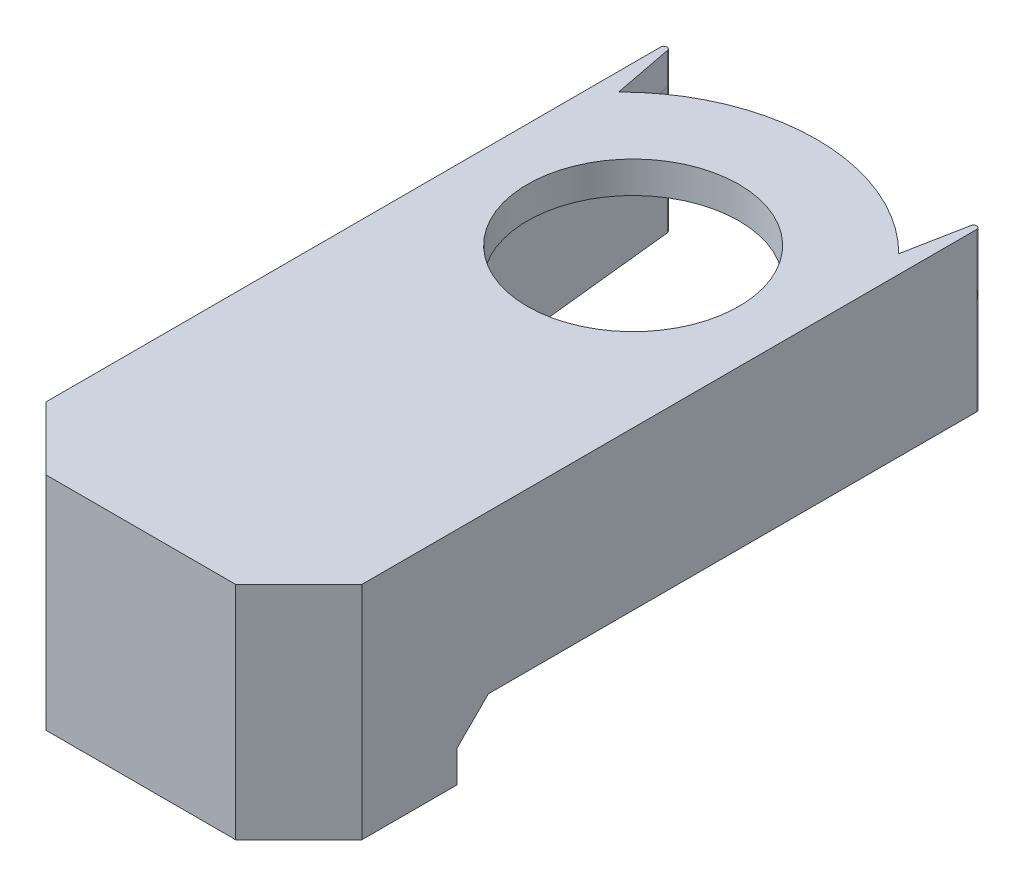
ISO-10303-21;
HEADER;
FILE_DESCRIPTION(('STEP AP214'),'2;1');
FILE_NAME('part.step','',(''),(''),'','','');
FILE_SCHEMA(('AUTOMOTIVE_DESIGN { 1 0 10303 214 1 1 1 1 }'));
ENDSEC;
DATA;
#1=APPLICATION_CONTEXT('core data for automotive mechanical design processes');
#2=APPLICATION_PROTOCOL_DEFINITION('international standard','automotive_design',2000,#1);
#3=PRODUCT_CONTEXT('',#1,'mechanical');
#4=PRODUCT('Part','Part','',(#3));
#5=PRODUCT_RELATED_PRODUCT_CATEGORY('part','',(#4));
#6=PRODUCT_DEFINITION_FORMATION('','',#4);
#7=PRODUCT_DEFINITION_CONTEXT('part definition',#1,'design');
#8=PRODUCT_DEFINITION('design','',#6,#7);
#9=PRODUCT_DEFINITION_SHAPE('','',#8);
#10=(LENGTH_UNIT() NAMED_UNIT(*) SI_UNIT(.MILLI.,.METRE.));
#11=(NAMED_UNIT(*) PLANE_ANGLE_UNIT() SI_UNIT($,.RADIAN.));
#12=(NAMED_UNIT(*) SI_UNIT($,.STERADIAN.) SOLID_ANGLE_UNIT());
#13=UNCERTAINTY_MEASURE_WITH_UNIT(LENGTH_MEASURE(1.E-05),#10,'distance_accuracy_value','');
#14=(GEOMETRIC_REPRESENTATION_CONTEXT(3) GLOBAL_UNCERTAINTY_ASSIGNED_CONTEXT((#13)) GLOBAL_UNIT_ASSIGNED_CONTEXT((#10,
#11,#12)) REPRESENTATION_CONTEXT('',''));
#15=CARTESIAN_POINT('',(0.,0.,0.));
#16=DIRECTION('',(0.,0.,1.));
#17=DIRECTION('',(1.,0.,0.));
#18=AXIS2_PLACEMENT_3D('',#15,#16,#17);
#19=CARTESIAN_POINT('',(-0.455233557203393,-11.7908287077193,19.5532997905264));
#20=DIRECTION('',(0.,1.,0.));
#21=DIRECTION('',(0.,0.,1.));
#22=AXIS2_PLACEMENT_3D('',#19,#20,#21);
#23=CYLINDRICAL_SURFACE('',#22,8.255);
#24=DIRECTION('',(0.,1.,0.));
#25=VECTOR('',#24,1.);
#26=CARTESIAN_POINT('',(-5.94705227001541,22.4991712922807,25.7164931369668));
#27=LINE('',#26,#25);
#28=CARTESIAN_POINT('',(-5.9470522700154,27.5791712922807,25.7164931369668));
#29=VERTEX_POINT('',#28);
#30=CARTESIAN_POINT('',(-5.94705227001542,17.4191712922807,25.7164931369668));
#31=VERTEX_POINT('',#30);
#32=EDGE_CURVE('E11',#29,#31,#27,.F.);
#33=ORIENTED_EDGE('',*,*,#32,.F.);
#34=CARTESIAN_POINT('',(-0.45523355720339,27.5791712922807,19.5532997905264));
#35=DIRECTION('',(0.,-1.,0.));
#36=DIRECTION('',(0.,0.,1.));
#37=AXIS2_PLACEMENT_3D('',#34,#35,#36);
#38=CIRCLE('',#37,8.255);
#39=CARTESIAN_POINT('',(6.06643984892261,27.5791712922807,24.6142088969843));
#40=VERTEX_POINT('',#39);
#41=EDGE_CURVE('E25',#40,#29,#38,.T.);
#42=ORIENTED_EDGE('',*,*,#41,.F.);
#43=DIRECTION('',(0.,1.,0.));
#44=VECTOR('',#43,1.);
#45=CARTESIAN_POINT('',(6.06643984892261,22.4991712922807,24.6142088969843));
#46=LINE('',#45,#44);
#47=CARTESIAN_POINT('',(6.06643984892261,17.4191712922807,24.6142088969843));
#48=VERTEX_POINT('',#47);
#49=EDGE_CURVE('E370',#48,#40,#46,.T.);
#50=ORIENTED_EDGE('',*,*,#49,.F.);
#51=CARTESIAN_POINT('',(-0.455233557203393,17.4191712922807,19.5532997905264));
#52=DIRECTION('',(0.,1.,0.));
#53=DIRECTION('',(0.,0.,1.));
#54=AXIS2_PLACEMENT_3D('',#51,#52,#53);
#55=CIRCLE('',#54,8.255);
#56=EDGE_CURVE('E367',#48,#31,#55,.F.);
#57=ORIENTED_EDGE('',*,*,#56,.T.);
#58=EDGE_LOOP('',(#33,#42,#50,#57));
#59=FACE_BOUND('',#58,.T.);
#60=ADVANCED_FACE('F17',(#59),#23,.F.);
#61=CARTESIAN_POINT('',(-13.1552335572034,17.4191712922807,-6.56059905085164));
#62=DIRECTION('',(0.,1.,0.));
#63=DIRECTION('',(0.,0.,1.));
#64=AXIS2_PLACEMENT_3D('',#61,#62,#63);
#65=PLANE('',#64);
#66=CARTESIAN_POINT('',(-0.687313488091051,17.4191712922807,17.0239245898732));
#67=DIRECTION('',(0.,1.,0.));
#68=DIRECTION('',(0.,0.,1.));
#69=AXIS2_PLACEMENT_3D('',#66,#67,#68);
#70=CIRCLE('',#69,10.16);
#71=CARTESIAN_POINT('',(9.47268651190895,17.4191712922807,17.0239245898732));
#72=VERTEX_POINT('',#71);
#73=EDGE_CURVE('E364',#48,#72,#70,.T.);
#74=ORIENTED_EDGE('',*,*,#73,.T.);
#75=DIRECTION('',(0.131328349639009,0.,-0.991338925182046));
#76=VECTOR('',#75,1.);
#77=CARTESIAN_POINT('',(11.7413599631441,17.4191712922807,-0.101275771804154));
#78=LINE('',#77,#76);
#79=CARTESIAN_POINT('',(11.7413599631441,17.4191712922807,-0.101275771804154));
#80=VERTEX_POINT('',#79);
#81=EDGE_CURVE('E361',#72,#80,#78,.T.);
#82=ORIENTED_EDGE('',*,*,#81,.T.);
#83=CARTESIAN_POINT('',(11.9907664427966,17.4191712922807,-0.0531882691935941));
#84=DIRECTION('',(0.,1.,0.));
#85=DIRECTION('',(0.,0.,1.));
#86=AXIS2_PLACEMENT_3D('',#83,#84,#85);
#87=CIRCLE('',#86,0.254);
#88=CARTESIAN_POINT('',(12.2447664427966,17.4191712922807,-0.0531882691935941));
#89=VERTEX_POINT('',#88);
#90=EDGE_CURVE('E358',#80,#89,#87,.F.);
#91=ORIENTED_EDGE('',*,*,#90,.T.);
#92=DIRECTION('',(0.,0.,1.));
#93=VECTOR('',#92,1.);
#94=CARTESIAN_POINT('',(12.2447664427966,17.4191712922807,-6.56059905085164));
#95=LINE('',#94,#93);
#96=CARTESIAN_POINT('',(12.2447664427966,17.4191712922807,39.1977997445264));
#97=VERTEX_POINT('',#96);
#98=EDGE_CURVE('E355',#89,#97,#95,.T.);
#99=ORIENTED_EDGE('',*,*,#98,.T.);
#100=DIRECTION('',(-1.,0.,0.));
#101=VECTOR('',#100,1.);
#102=CARTESIAN_POINT('',(-13.1552335572034,17.4191712922807,39.1977997445264));
#103=LINE('',#102,#101);
#104=CARTESIAN_POINT('',(-13.1552335572034,17.4191712922807,39.1977997445264));
#105=VERTEX_POINT('',#104);
#106=EDGE_CURVE('E352',#97,#105,#103,.T.);
#107=ORIENTED_EDGE('',*,*,#106,.T.);
#108=DIRECTION('',(0.,0.,1.));
#109=VECTOR('',#108,1.);
#110=CARTESIAN_POINT('',(-13.1552335572034,17.4191712922807,-6.56059905085164));
#111=LINE('',#110,#109);
#112=CARTESIAN_POINT('',(-13.1552335572034,17.4191712922807,-0.053188269193601));
#113=VERTEX_POINT('',#112);
#114=EDGE_CURVE('E348',#113,#105,#111,.T.);
#115=ORIENTED_EDGE('',*,*,#114,.F.);
#116=CARTESIAN_POINT('',(-12.9012335572034,17.4191712922807,-0.053188269193601));
#117=DIRECTION('',(0.,1.,0.));
#118=DIRECTION('',(0.,0.,1.));
#119=AXIS2_PLACEMENT_3D('',#116,#117,#118);
#120=CIRCLE('',#119,0.254);
#121=CARTESIAN_POINT('',(-12.6518270775508,17.4191712922807,-0.101275771804161));
#122=VERTEX_POINT('',#121);
#123=EDGE_CURVE('E345',#113,#122,#120,.F.);
#124=ORIENTED_EDGE('',*,*,#123,.T.);
#125=DIRECTION('',(0.104791666901886,0.,0.994494196336974));
#126=VECTOR('',#125,1.);
#127=CARTESIAN_POINT('',(-12.6518270775508,17.4191712922807,-0.101275771804161));
#128=LINE('',#127,#126);
#129=CARTESIAN_POINT('',(-10.8473134880911,17.4191712922807,17.0239245898732));
#130=VERTEX_POINT('',#129);
#131=EDGE_CURVE('E342',#122,#130,#128,.T.);
#132=ORIENTED_EDGE('',*,*,#131,.T.);
#133=EDGE_CURVE('E194',#130,#31,#70,.T.);
#134=ORIENTED_EDGE('',*,*,#133,.T.);
#135=ORIENTED_EDGE('',*,*,#56,.F.);
#136=EDGE_LOOP('',(#74,#82,#91,#99,#107,#115,#124,#132,#134,#135));
#137=FACE_BOUND('',#136,.T.);
#138=ADVANCED_FACE('F468',(#137),#65,.F.);
#139=CARTESIAN_POINT('',(-13.1552335572034,-11.7908287077193,-2.71220025547363));
#140=DIRECTION('',(-0.981915274222651,0.,0.189320876419524));
#141=DIRECTION('',(0.189320876419524,0.,0.981915274222651));
#142=AXIS2_PLACEMENT_3D('',#139,#140,#141);
#143=PLANE('',#142);
#144=DIRECTION('',(-0.189320876419524,0.,-0.981915274222651));
#145=VECTOR('',#144,1.);
#146=CARTESIAN_POINT('',(-13.1552335572034,30.1191712922807,-2.71220025547363));
#147=LINE('',#146,#145);
#148=CARTESIAN_POINT('',(-11.7130471803084,30.1191712922807,4.76771880327323));
#149=VERTEX_POINT('',#148);
#150=CARTESIAN_POINT('',(-12.6518270775508,30.1191712922807,-0.101275771804161));
#151=VERTEX_POINT('',#150);
#152=EDGE_CURVE('E338',#149,#151,#147,.T.);
#153=ORIENTED_EDGE('',*,*,#152,.F.);
#154=DIRECTION('',(0.,1.,0.));
#155=VECTOR('',#154,1.);
#156=CARTESIAN_POINT('',(-11.7130471803084,2.28078660067512,4.76771880327323));
#157=LINE('',#156,#155);
#158=CARTESIAN_POINT('',(-11.7130471803084,27.5791712922807,4.76771880327323));
#159=VERTEX_POINT('',#158);
#160=EDGE_CURVE('E334',#159,#149,#157,.T.);
#161=ORIENTED_EDGE('',*,*,#160,.F.);
#162=DIRECTION('',(-0.189320876419524,0.,-0.981915274222651));
#163=VECTOR('',#162,1.);
#164=CARTESIAN_POINT('',(-13.1552335572034,27.5791712922807,-2.71220025547363));
#165=LINE('',#164,#163);
#166=CARTESIAN_POINT('',(-12.6518270775508,27.5791712922807,-0.101275771804161));
#167=VERTEX_POINT('',#166);
#168=EDGE_CURVE('E331',#159,#167,#165,.T.);
#169=ORIENTED_EDGE('',*,*,#168,.T.);
#170=DIRECTION('',(0.,-1.,0.));
#171=VECTOR('',#170,1.);
#172=CARTESIAN_POINT('',(-12.6518270775508,-11.7908287077193,-0.101275771804161));
#173=LINE('',#172,#171);
#174=EDGE_CURVE('E328',#167,#151,#173,.F.);
#175=ORIENTED_EDGE('',*,*,#174,.T.);
#176=EDGE_LOOP('',(#153,#161,#169,#175));
#177=FACE_BOUND('',#176,.T.);
#178=ADVANCED_FACE('F457',(#177),#143,.F.);
#179=CARTESIAN_POINT('',(12.2447664427966,-11.7908287077193,-2.71220025547363));
#180=DIRECTION('',(0.981915274222651,0.,0.189320876419524));
#181=DIRECTION('',(0.189320876419524,0.,-0.981915274222651));
#182=AXIS2_PLACEMENT_3D('',#179,#180,#181);
#183=PLANE('',#182);
#184=DIRECTION('',(-0.189320876419524,0.,0.981915274222651));
#185=VECTOR('',#184,1.);
#186=CARTESIAN_POINT('',(12.2447664427966,27.5791712922807,-2.71220025547363));
#187=LINE('',#186,#185);
#188=CARTESIAN_POINT('',(11.7413599631441,27.5791712922807,-0.101275771804154));
#189=VERTEX_POINT('',#188);
#190=CARTESIAN_POINT('',(10.8025800659016,27.5791712922807,4.76771880327323));
#191=VERTEX_POINT('',#190);
#192=EDGE_CURVE('E325',#189,#191,#187,.T.);
#193=ORIENTED_EDGE('',*,*,#192,.T.);
#194=DIRECTION('',(0.,1.,0.));
#195=VECTOR('',#194,1.);
#196=CARTESIAN_POINT('',(10.8025800659016,2.28078660067512,4.76771880327322));
#197=LINE('',#196,#195);
#198=CARTESIAN_POINT('',(10.8025800659016,30.1191712922807,4.76771880327323));
#199=VERTEX_POINT('',#198);
#200=EDGE_CURVE('E322',#191,#199,#197,.T.);
#201=ORIENTED_EDGE('',*,*,#200,.T.);
#202=DIRECTION('',(-0.189320876419524,0.,0.981915274222651));
#203=VECTOR('',#202,1.);
#204=CARTESIAN_POINT('',(12.2447664427966,30.1191712922807,-2.71220025547363));
#205=LINE('',#204,#203);
#206=CARTESIAN_POINT('',(11.7413599631441,30.1191712922807,-0.101275771804154));
#207=VERTEX_POINT('',#206);
#208=EDGE_CURVE('E318',#207,#199,#205,.T.);
#209=ORIENTED_EDGE('',*,*,#208,.F.);
#210=DIRECTION('',(0.,-1.,0.));
#211=VECTOR('',#210,1.);
#212=CARTESIAN_POINT('',(11.7413599631441,-11.7908287077193,-0.101275771804154));
#213=LINE('',#212,#211);
#214=EDGE_CURVE('E315',#207,#189,#213,.T.);
#215=ORIENTED_EDGE('',*,*,#214,.T.);
#216=EDGE_LOOP('',(#193,#201,#209,#215));
#217=FACE_BOUND('',#216,.T.);
#218=ADVANCED_FACE('F460',(#217),#183,.F.);
#219=CARTESIAN_POINT('',(-13.1552335572034,32.6591712922807,41.7377997445264));
#220=DIRECTION('',(1.,0.,0.));
#221=DIRECTION('',(0.,0.,-1.));
#222=AXIS2_PLACEMENT_3D('',#219,#220,#221);
#223=PLANE('',#222);
#224=DIRECTION('',(0.,0.,1.));
#225=VECTOR('',#224,1.);
#226=CARTESIAN_POINT('',(-13.1552335572034,30.1191712922807,41.7377997445264));
#227=LINE('',#226,#225);
#228=CARTESIAN_POINT('',(-13.1552335572034,30.1191712922807,-0.0531882691935975));
#229=VERTEX_POINT('',#228);
#230=CARTESIAN_POINT('',(-13.1552335572034,30.1191712922807,49.3577997445264));
#231=VERTEX_POINT('',#230);
#232=EDGE_CURVE('E311',#229,#231,#227,.T.);
#233=ORIENTED_EDGE('',*,*,#232,.F.);
#234=DIRECTION('',(0.,-1.,0.));
#235=VECTOR('',#234,1.);
#236=CARTESIAN_POINT('',(-13.1552335572034,32.6591712922807,-0.053188269193601));
#237=LINE('',#236,#235);
#238=EDGE_CURVE('E307',#229,#113,#237,.T.);
#239=ORIENTED_EDGE('',*,*,#238,.T.);
#240=ORIENTED_EDGE('',*,*,#114,.T.);
#241=DIRECTION('',(0.,0.707106781186552,-0.707106781186543));
#242=VECTOR('',#241,1.);
#243=CARTESIAN_POINT('',(-13.1552335572034,23.7691712922808,32.8477997445264));
#244=LINE('',#243,#242);
#245=CARTESIAN_POINT('',(-13.1552335572034,14.8791712922807,41.7377997445264));
#246=VERTEX_POINT('',#245);
#247=EDGE_CURVE('E304',#105,#246,#244,.F.);
#248=ORIENTED_EDGE('',*,*,#247,.T.);
#249=DIRECTION('',(0.,-1.,0.));
#250=VECTOR('',#249,1.);
#251=CARTESIAN_POINT('',(-13.1552335572034,-11.7908287077193,41.7377997445264));
#252=LINE('',#251,#250);
#253=CARTESIAN_POINT('',(-13.1552335572034,12.3391712922807,41.7377997445264));
#254=VERTEX_POINT('',#253);
#255=EDGE_CURVE('E301',#246,#254,#252,.T.);
#256=ORIENTED_EDGE('',*,*,#255,.T.);
#257=DIRECTION('',(0.,0.,-1.));
#258=VECTOR('',#257,1.);
#259=CARTESIAN_POINT('',(-13.1552335572034,12.3391712922807,41.7377997445264));
#260=LINE('',#259,#258);
#261=CARTESIAN_POINT('',(-13.1552335572034,12.3391712922807,49.3577997445264));
#262=VERTEX_POINT('',#261);
#263=EDGE_CURVE('E297',#262,#254,#260,.T.);
#264=ORIENTED_EDGE('',*,*,#263,.F.);
#265=DIRECTION('',(0.,1.,0.));
#266=VECTOR('',#265,1.);
#267=CARTESIAN_POINT('',(-13.1552335572034,32.6591712922807,49.3577997445264));
#268=LINE('',#267,#266);
#269=EDGE_CURVE('E294',#262,#231,#268,.T.);
#270=ORIENTED_EDGE('',*,*,#269,.T.);
#271=EDGE_LOOP('',(#233,#239,#240,#248,#256,#264,#270));
#272=FACE_BOUND('',#271,.T.);
#273=ADVANCED_FACE('F479',(#272),#223,.F.);
#274=CARTESIAN_POINT('',(12.2447664427966,32.6591712922807,41.7377997445264));
#275=DIRECTION('',(-1.,0.,0.));
#276=DIRECTION('',(0.,0.,1.));
#277=AXIS2_PLACEMENT_3D('',#274,#275,#276);
#278=PLANE('',#277);
#279=DIRECTION('',(0.,0.,-1.));
#280=VECTOR('',#279,1.);
#281=CARTESIAN_POINT('',(12.2447664427966,30.1191712922807,41.7377997445264));
#282=LINE('',#281,#280);
#283=CARTESIAN_POINT('',(12.2447664427966,30.1191712922807,49.3577997445264));
#284=VERTEX_POINT('',#283);
#285=CARTESIAN_POINT('',(12.2447664427966,30.1191712922807,-0.0531882691935941));
#286=VERTEX_POINT('',#285);
#287=EDGE_CURVE('E290',#284,#286,#282,.T.);
#288=ORIENTED_EDGE('',*,*,#287,.F.);
#289=DIRECTION('',(0.,-1.,0.));
#290=VECTOR('',#289,1.);
#291=CARTESIAN_POINT('',(12.2447664427966,-11.7908287077193,49.3577997445264));
#292=LINE('',#291,#290);
#293=CARTESIAN_POINT('',(12.2447664427966,12.3391712922807,49.3577997445264));
#294=VERTEX_POINT('',#293);
#295=EDGE_CURVE('E287',#284,#294,#292,.T.);
#296=ORIENTED_EDGE('',*,*,#295,.T.);
#297=DIRECTION('',(0.,0.,1.));
#298=VECTOR('',#297,1.);
#299=CARTESIAN_POINT('',(12.2447664427966,12.3391712922807,41.7377997445264));
#300=LINE('',#299,#298);
#301=CARTESIAN_POINT('',(12.2447664427966,12.3391712922807,41.7377997445264));
#302=VERTEX_POINT('',#301);
#303=EDGE_CURVE('E283',#302,#294,#300,.T.);
#304=ORIENTED_EDGE('',*,*,#303,.F.);
#305=DIRECTION('',(0.,1.,0.));
#306=VECTOR('',#305,1.);
#307=CARTESIAN_POINT('',(12.2447664427966,-11.7908287077193,41.7377997445264));
#308=LINE('',#307,#306);
#309=CARTESIAN_POINT('',(12.2447664427966,14.8791712922807,41.7377997445264));
#310=VERTEX_POINT('',#309);
#311=EDGE_CURVE('E280',#302,#310,#308,.T.);
#312=ORIENTED_EDGE('',*,*,#311,.T.);
#313=DIRECTION('',(0.,-0.707106781186552,0.707106781186543));
#314=VECTOR('',#313,1.);
#315=CARTESIAN_POINT('',(12.2447664427966,23.7691712922808,32.8477997445264));
#316=LINE('',#315,#314);
#317=EDGE_CURVE('E276',#310,#97,#316,.F.);
#318=ORIENTED_EDGE('',*,*,#317,.T.);
#319=ORIENTED_EDGE('',*,*,#98,.F.);
#320=DIRECTION('',(0.,-1.,0.));
#321=VECTOR('',#320,1.);
#322=CARTESIAN_POINT('',(12.2447664427966,32.6591712922807,-0.0531882691935941));
#323=LINE('',#322,#321);
#324=EDGE_CURVE('E273',#89,#286,#323,.F.);
#325=ORIENTED_EDGE('',*,*,#324,.T.);
#326=EDGE_LOOP('',(#288,#296,#304,#312,#318,#319,#325));
#327=FACE_BOUND('',#326,.T.);
#328=ADVANCED_FACE('F470',(#327),#278,.F.);
#329=CARTESIAN_POINT('',(-13.1552335572034,-11.7908287077193,54.4377997445264));
#330=DIRECTION('',(0.,0.,1.));
#331=DIRECTION('',(1.,0.,0.));
#332=AXIS2_PLACEMENT_3D('',#329,#330,#331);
#333=PLANE('',#332);
#334=DIRECTION('',(0.,1.,0.));
#335=VECTOR('',#334,1.);
#336=CARTESIAN_POINT('',(7.16476644279661,32.6591712922807,54.4377997445264));
#337=LINE('',#336,#335);
#338=CARTESIAN_POINT('',(7.16476644279661,12.3391712922807,54.4377997445264));
#339=VERTEX_POINT('',#338);
#340=CARTESIAN_POINT('',(7.16476644279661,30.1191712922807,54.4377997445264));
#341=VERTEX_POINT('',#340);
#342=EDGE_CURVE('E270',#339,#341,#337,.T.);
#343=ORIENTED_EDGE('',*,*,#342,.T.);
#344=DIRECTION('',(-1.,0.,0.));
#345=VECTOR('',#344,1.);
#346=CARTESIAN_POINT('',(-13.1552335572034,30.1191712922807,54.4377997445264));
#347=LINE('',#346,#345);
#348=CARTESIAN_POINT('',(-8.0752335572034,30.1191712922807,54.4377997445264));
#349=VERTEX_POINT('',#348);
#350=EDGE_CURVE('E267',#341,#349,#347,.T.);
#351=ORIENTED_EDGE('',*,*,#350,.T.);
#352=DIRECTION('',(0.,-1.,0.));
#353=VECTOR('',#352,1.);
#354=CARTESIAN_POINT('',(-8.0752335572034,-11.7908287077193,54.4377997445264));
#355=LINE('',#354,#353);
#356=CARTESIAN_POINT('',(-8.0752335572034,12.3391712922807,54.4377997445264));
#357=VERTEX_POINT('',#356);
#358=EDGE_CURVE('E264',#349,#357,#355,.T.);
#359=ORIENTED_EDGE('',*,*,#358,.T.);
#360=DIRECTION('',(1.,0.,0.));
#361=VECTOR('',#360,1.);
#362=CARTESIAN_POINT('',(-13.1552335572034,12.3391712922807,54.4377997445264));
#363=LINE('',#362,#361);
#364=EDGE_CURVE('E261',#357,#339,#363,.T.);
#365=ORIENTED_EDGE('',*,*,#364,.T.);
#366=EDGE_LOOP('',(#343,#351,#359,#365));
#367=FACE_BOUND('',#366,.T.);
#368=ADVANCED_FACE('F502',(#367),#333,.T.);
#369=CARTESIAN_POINT('',(7.16476644279661,-11.7908287077193,54.4377997445264));
#370=DIRECTION('',(0.707106781186549,0.,0.707106781186546));
#371=DIRECTION('',(0.,-1.,0.));
#372=AXIS2_PLACEMENT_3D('',#369,#370,#371);
#373=PLANE('',#372);
#374=ORIENTED_EDGE('',*,*,#295,.F.);
#375=DIRECTION('',(-0.707106781186546,0.,0.707106781186549));
#376=VECTOR('',#375,1.);
#377=CARTESIAN_POINT('',(7.16476644279661,30.1191712922807,54.4377997445264));
#378=LINE('',#377,#376);
#379=EDGE_CURVE('E257',#284,#341,#378,.T.);
#380=ORIENTED_EDGE('',*,*,#379,.T.);
#381=ORIENTED_EDGE('',*,*,#342,.F.);
#382=DIRECTION('',(0.707106781186546,0.,-0.707106781186549));
#383=VECTOR('',#382,1.);
#384=CARTESIAN_POINT('',(7.16476644279661,12.3391712922807,54.4377997445264));
#385=LINE('',#384,#383);
#386=EDGE_CURVE('E253',#339,#294,#385,.T.);
#387=ORIENTED_EDGE('',*,*,#386,.T.);
#388=EDGE_LOOP('',(#374,#380,#381,#387));
#389=FACE_BOUND('',#388,.T.);
#390=ADVANCED_FACE('F505',(#389),#373,.T.);
#391=CARTESIAN_POINT('',(-8.0752335572034,-11.7908287077193,54.4377997445264));
#392=DIRECTION('',(-0.707106781186549,0.,0.707106781186546));
#393=DIRECTION('',(0.,1.,0.));
#394=AXIS2_PLACEMENT_3D('',#391,#392,#393);
#395=PLANE('',#394);
#396=ORIENTED_EDGE('',*,*,#358,.F.);
#397=DIRECTION('',(-0.707106781186546,0.,-0.707106781186549));
#398=VECTOR('',#397,1.);
#399=CARTESIAN_POINT('',(-8.0752335572034,30.1191712922807,54.4377997445264));
#400=LINE('',#399,#398);
#401=EDGE_CURVE('E249',#349,#231,#400,.T.);
#402=ORIENTED_EDGE('',*,*,#401,.T.);
#403=ORIENTED_EDGE('',*,*,#269,.F.);
#404=DIRECTION('',(0.707106781186546,0.,0.707106781186549));
#405=VECTOR('',#404,1.);
#406=CARTESIAN_POINT('',(-8.0752335572034,12.3391712922807,54.4377997445264));
#407=LINE('',#406,#405);
#408=EDGE_CURVE('E245',#262,#357,#407,.T.);
#409=ORIENTED_EDGE('',*,*,#408,.T.);
#410=EDGE_LOOP('',(#396,#402,#403,#409));
#411=FACE_BOUND('',#410,.T.);
#412=ADVANCED_FACE('F509',(#411),#395,.T.);
#413=CARTESIAN_POINT('',(11.9907664427966,-11.7908287077193,-0.0531882691935941));
#414=DIRECTION('',(0.,-1.,0.));
#415=DIRECTION('',(0.,0.,-1.));
#416=AXIS2_PLACEMENT_3D('',#413,#414,#415);
#417=CYLINDRICAL_SURFACE('',#416,0.254);
#418=ORIENTED_EDGE('',*,*,#214,.F.);
#419=CARTESIAN_POINT('',(11.9907664427966,30.1191712922807,-0.0531882691935941));
#420=DIRECTION('',(0.,1.,0.));
#421=DIRECTION('',(0.,0.,1.));
#422=AXIS2_PLACEMENT_3D('',#419,#420,#421);
#423=CIRCLE('',#422,0.254);
#424=EDGE_CURVE('E241',#207,#286,#423,.F.);
#425=ORIENTED_EDGE('',*,*,#424,.T.);
#426=ORIENTED_EDGE('',*,*,#324,.F.);
#427=ORIENTED_EDGE('',*,*,#90,.F.);
#428=DIRECTION('',(0.,1.,0.));
#429=VECTOR('',#428,1.);
#430=CARTESIAN_POINT('',(11.7413599631441,-77.0996272615303,-0.101275771804165));
#431=LINE('',#430,#429);
#432=EDGE_CURVE('E237',#80,#189,#431,.T.);
#433=ORIENTED_EDGE('',*,*,#432,.T.);
#434=EDGE_LOOP('',(#418,#425,#426,#427,#433));
#435=FACE_BOUND('',#434,.T.);
#436=ADVANCED_FACE('F464',(#435),#417,.T.);
#437=CARTESIAN_POINT('',(-12.9012335572034,32.6591712922807,-0.053188269193601));
#438=DIRECTION('',(0.,-1.,0.));
#439=DIRECTION('',(0.,0.,-1.));
#440=AXIS2_PLACEMENT_3D('',#437,#438,#439);
#441=CYLINDRICAL_SURFACE('',#440,0.254);
#442=ORIENTED_EDGE('',*,*,#238,.F.);
#443=CARTESIAN_POINT('',(-12.9012335572034,30.1191712922807,-0.053188269193601));
#444=DIRECTION('',(0.,1.,0.));
#445=DIRECTION('',(0.,0.,1.));
#446=AXIS2_PLACEMENT_3D('',#443,#444,#445);
#447=CIRCLE('',#446,0.254);
#448=EDGE_CURVE('E233',#229,#151,#447,.F.);
#449=ORIENTED_EDGE('',*,*,#448,.T.);
#450=ORIENTED_EDGE('',*,*,#174,.F.);
#451=EDGE_CURVE('E202',#122,#167,#173,.F.);
#452=ORIENTED_EDGE('',*,*,#451,.F.);
#453=ORIENTED_EDGE('',*,*,#123,.F.);
#454=EDGE_LOOP('',(#442,#449,#450,#452,#453));
#455=FACE_BOUND('',#454,.T.);
#456=ADVANCED_FACE('F484',(#455),#441,.T.);
#457=CARTESIAN_POINT('',(-13.1552335572034,-11.7908287077193,41.7377997445264));
#458=DIRECTION('',(0.,0.,1.));
#459=DIRECTION('',(1.,0.,0.));
#460=AXIS2_PLACEMENT_3D('',#457,#458,#459);
#461=PLANE('',#460);
#462=DIRECTION('',(1.,0.,0.));
#463=VECTOR('',#462,1.);
#464=CARTESIAN_POINT('',(-13.1552335572034,12.3391712922807,41.7377997445264));
#465=LINE('',#464,#463);
#466=EDGE_CURVE('E229',#254,#302,#465,.T.);
#467=ORIENTED_EDGE('',*,*,#466,.F.);
#468=ORIENTED_EDGE('',*,*,#255,.F.);
#469=DIRECTION('',(1.,0.,0.));
#470=VECTOR('',#469,1.);
#471=CARTESIAN_POINT('',(12.2447664427966,14.8791712922807,41.7377997445264));
#472=LINE('',#471,#470);
#473=EDGE_CURVE('E225',#246,#310,#472,.T.);
#474=ORIENTED_EDGE('',*,*,#473,.T.);
#475=ORIENTED_EDGE('',*,*,#311,.F.);
#476=EDGE_LOOP('',(#467,#468,#474,#475));
#477=FACE_BOUND('',#476,.T.);
#478=ADVANCED_FACE('F518',(#477),#461,.F.);
#479=CARTESIAN_POINT('',(-13.1552335572034,14.8791712922807,41.7377997445264));
#480=DIRECTION('',(0.,-0.707106781186543,-0.707106781186552));
#481=DIRECTION('',(-1.,0.,0.));
#482=AXIS2_PLACEMENT_3D('',#479,#480,#481);
#483=PLANE('',#482);
#484=ORIENTED_EDGE('',*,*,#247,.F.);
#485=ORIENTED_EDGE('',*,*,#106,.F.);
#486=ORIENTED_EDGE('',*,*,#317,.F.);
#487=ORIENTED_EDGE('',*,*,#473,.F.);
#488=EDGE_LOOP('',(#484,#485,#486,#487));
#489=FACE_BOUND('',#488,.T.);
#490=ADVANCED_FACE('F477',(#489),#483,.T.);
#491=CARTESIAN_POINT('',(-5.09010158474576,12.3391712922807,0.731680353062175));
#492=DIRECTION('',(0.,-1.,0.));
#493=DIRECTION('',(0.,0.,-1.));
#494=AXIS2_PLACEMENT_3D('',#491,#492,#493);
#495=PLANE('',#494);
#496=ORIENTED_EDGE('',*,*,#408,.F.);
#497=ORIENTED_EDGE('',*,*,#263,.T.);
#498=ORIENTED_EDGE('',*,*,#466,.T.);
#499=ORIENTED_EDGE('',*,*,#303,.T.);
#500=ORIENTED_EDGE('',*,*,#386,.F.);
#501=ORIENTED_EDGE('',*,*,#364,.F.);
#502=EDGE_LOOP('',(#496,#497,#498,#499,#500,#501));
#503=FACE_BOUND('',#502,.T.);
#504=ADVANCED_FACE('F524',(#503),#495,.T.);
#505=CARTESIAN_POINT('',(-0.455233557203383,27.5791712922807,19.5532997905264));
#506=DIRECTION('',(0.,-1.,0.));
#507=DIRECTION('',(0.,0.,-1.));
#508=AXIS2_PLACEMENT_3D('',#505,#506,#507);
#509=PLANE('',#508);
#510=CARTESIAN_POINT('',(-0.455233557203383,27.5791712922807,14.8632997905264));
#511=DIRECTION('',(0.,-1.,0.));
#512=DIRECTION('',(0.,0.,-1.));
#513=AXIS2_PLACEMENT_3D('',#510,#511,#512);
#514=CIRCLE('',#513,8.5);
#515=CARTESIAN_POINT('',(-0.455233557203383,27.5791712922807,6.3632997905264));
#516=VERTEX_POINT('',#515);
#517=EDGE_CURVE('E221',#516,#516,#514,.F.);
#518=ORIENTED_EDGE('',*,*,#517,.T.);
#519=EDGE_LOOP('',(#518));
#520=FACE_BOUND('',#519,.T.);
#521=CARTESIAN_POINT('',(-0.455233557203393,27.5791712922807,16.0255324263782));
#522=DIRECTION('',(0.,-1.,0.));
#523=DIRECTION('',(0.,0.,-1.));
#524=AXIS2_PLACEMENT_3D('',#521,#522,#523);
#525=CIRCLE('',#524,15.9209527084637);
#526=EDGE_CURVE('E217',#191,#159,#525,.F.);
#527=ORIENTED_EDGE('',*,*,#526,.F.);
#528=ORIENTED_EDGE('',*,*,#192,.F.);
#529=DIRECTION('',(0.131328349639009,0.,-0.991338925182046));
#530=VECTOR('',#529,1.);
#531=CARTESIAN_POINT('',(11.7413599631441,27.5791712922807,-0.101275771804152));
#532=LINE('',#531,#530);
#533=CARTESIAN_POINT('',(9.47268651190895,27.5791712922807,17.0239245898732));
#534=VERTEX_POINT('',#533);
#535=EDGE_CURVE('E213',#534,#189,#532,.T.);
#536=ORIENTED_EDGE('',*,*,#535,.F.);
#537=CARTESIAN_POINT('',(-0.687313488091051,27.5791712922807,17.0239245898732));
#538=DIRECTION('',(0.,1.,0.));
#539=DIRECTION('',(0.,0.,1.));
#540=AXIS2_PLACEMENT_3D('',#537,#538,#539);
#541=CIRCLE('',#540,10.16);
#542=EDGE_CURVE('E187',#40,#534,#541,.T.);
#543=ORIENTED_EDGE('',*,*,#542,.F.);
#544=ORIENTED_EDGE('',*,*,#41,.T.);
#545=CARTESIAN_POINT('',(-10.8473134880911,27.5791712922807,17.0239245898732));
#546=VERTEX_POINT('',#545);
#547=EDGE_CURVE('E177',#546,#29,#541,.T.);
#548=ORIENTED_EDGE('',*,*,#547,.F.);
#549=DIRECTION('',(0.104791666901886,0.,0.994494196336974));
#550=VECTOR('',#549,1.);
#551=CARTESIAN_POINT('',(-12.6518270775508,27.5791712922807,-0.101275771804159));
#552=LINE('',#551,#550);
#553=EDGE_CURVE('E183',#167,#546,#552,.T.);
#554=ORIENTED_EDGE('',*,*,#553,.F.);
#555=ORIENTED_EDGE('',*,*,#168,.F.);
#556=EDGE_LOOP('',(#527,#528,#536,#543,#544,#548,#554,#555));
#557=FACE_BOUND('',#556,.T.);
#558=ADVANCED_FACE('F180',(#520,#557),#509,.T.);
#559=CARTESIAN_POINT('',(-0.455233557203383,30.1191712922807,19.5532997905264));
#560=DIRECTION('',(0.,-1.,0.));
#561=DIRECTION('',(0.,0.,-1.));
#562=AXIS2_PLACEMENT_3D('',#559,#560,#561);
#563=PLANE('',#562);
#564=CARTESIAN_POINT('',(-0.455233557203383,30.1191712922807,14.8632997905264));
#565=DIRECTION('',(0.,1.,0.));
#566=DIRECTION('',(0.,0.,1.));
#567=AXIS2_PLACEMENT_3D('',#564,#565,#566);
#568=CIRCLE('',#567,8.5);
#569=CARTESIAN_POINT('',(-0.455233557203383,30.1191712922807,23.3632997905264));
#570=VERTEX_POINT('',#569);
#571=EDGE_CURVE('E204',#570,#570,#568,.T.);
#572=ORIENTED_EDGE('',*,*,#571,.F.);
#573=EDGE_LOOP('',(#572));
#574=FACE_BOUND('',#573,.T.);
#575=ORIENTED_EDGE('',*,*,#208,.T.);
#576=CARTESIAN_POINT('',(-0.455233557203393,30.1191712922807,16.0255324263782));
#577=DIRECTION('',(0.,1.,0.));
#578=DIRECTION('',(0.,0.,-1.));
#579=AXIS2_PLACEMENT_3D('',#576,#577,#578);
#580=CIRCLE('',#579,15.9209527084637);
#581=EDGE_CURVE('E209',#199,#149,#580,.T.);
#582=ORIENTED_EDGE('',*,*,#581,.T.);
#583=ORIENTED_EDGE('',*,*,#152,.T.);
#584=ORIENTED_EDGE('',*,*,#448,.F.);
#585=ORIENTED_EDGE('',*,*,#232,.T.);
#586=ORIENTED_EDGE('',*,*,#401,.F.);
#587=ORIENTED_EDGE('',*,*,#350,.F.);
#588=ORIENTED_EDGE('',*,*,#379,.F.);
#589=ORIENTED_EDGE('',*,*,#287,.T.);
#590=ORIENTED_EDGE('',*,*,#424,.F.);
#591=EDGE_LOOP('',(#575,#582,#583,#584,#585,#586,#587,#588,#589,#590));
#592=FACE_BOUND('',#591,.T.);
#593=ADVANCED_FACE('F450',(#574,#592),#563,.F.);
#594=CARTESIAN_POINT('',(11.7413599631441,-77.0996272615303,-0.101275771804165));
#595=DIRECTION('',(-0.991338925182046,0.,-0.131328349639009));
#596=DIRECTION('',(-0.131328349639009,0.,0.991338925182046));
#597=AXIS2_PLACEMENT_3D('',#594,#595,#596);
#598=PLANE('',#597);
#599=ORIENTED_EDGE('',*,*,#81,.F.);
#600=DIRECTION('',(0.,1.,0.));
#601=VECTOR('',#600,1.);
#602=CARTESIAN_POINT('',(9.47268651190895,-77.0996272615303,17.0239245898732));
#603=LINE('',#602,#601);
#604=EDGE_CURVE('E198',#72,#534,#603,.T.);
#605=ORIENTED_EDGE('',*,*,#604,.T.);
#606=ORIENTED_EDGE('',*,*,#535,.T.);
#607=ORIENTED_EDGE('',*,*,#432,.F.);
#608=EDGE_LOOP('',(#599,#605,#606,#607));
#609=FACE_BOUND('',#608,.T.);
#610=ADVANCED_FACE('F441',(#609),#598,.T.);
#611=CARTESIAN_POINT('',(-0.687313488091051,-77.0996272615303,17.0239245898732));
#612=DIRECTION('',(0.,1.,0.));
#613=DIRECTION('',(0.,0.,1.));
#614=AXIS2_PLACEMENT_3D('',#611,#612,#613);
#615=CYLINDRICAL_SURFACE('',#614,10.16);
#616=ORIENTED_EDGE('',*,*,#73,.F.);
#617=ORIENTED_EDGE('',*,*,#49,.T.);
#618=ORIENTED_EDGE('',*,*,#542,.T.);
#619=ORIENTED_EDGE('',*,*,#604,.F.);
#620=EDGE_LOOP('',(#616,#617,#618,#619));
#621=FACE_BOUND('',#620,.T.);
#622=ADVANCED_FACE('F435',(#621),#615,.F.);
#623=ORIENTED_EDGE('',*,*,#547,.T.);
#624=ORIENTED_EDGE('',*,*,#32,.T.);
#625=ORIENTED_EDGE('',*,*,#133,.F.);
#626=DIRECTION('',(0.,1.,0.));
#627=VECTOR('',#626,1.);
#628=CARTESIAN_POINT('',(-10.8473134880911,-77.0996272615303,17.0239245898732));
#629=LINE('',#628,#627);
#630=EDGE_CURVE('E191',#130,#546,#629,.T.);
#631=ORIENTED_EDGE('',*,*,#630,.T.);
#632=EDGE_LOOP('',(#623,#624,#625,#631));
#633=FACE_BOUND('',#632,.T.);
#634=ADVANCED_FACE('F192',(#633),#615,.F.);
#635=CARTESIAN_POINT('',(-12.6518270775508,-77.0996272615303,-0.101275771804172));
#636=DIRECTION('',(0.994494196336974,0.,-0.104791666901886));
#637=DIRECTION('',(-0.104791666901886,0.,-0.994494196336974));
#638=AXIS2_PLACEMENT_3D('',#635,#636,#637);
#639=PLANE('',#638);
#640=ORIENTED_EDGE('',*,*,#131,.F.);
#641=ORIENTED_EDGE('',*,*,#451,.T.);
#642=ORIENTED_EDGE('',*,*,#553,.T.);
#643=ORIENTED_EDGE('',*,*,#630,.F.);
#644=EDGE_LOOP('',(#640,#641,#642,#643));
#645=FACE_BOUND('',#644,.T.);
#646=ADVANCED_FACE('F200',(#645),#639,.T.);
#647=CARTESIAN_POINT('',(-0.455233557203393,2.28078660067512,16.0255324263782));
#648=DIRECTION('',(0.,1.,0.));
#649=DIRECTION('',(0.,0.,1.));
#650=AXIS2_PLACEMENT_3D('',#647,#648,#649);
#651=CYLINDRICAL_SURFACE('',#650,15.9209527084637);
#652=ORIENTED_EDGE('',*,*,#200,.F.);
#653=ORIENTED_EDGE('',*,*,#526,.T.);
#654=ORIENTED_EDGE('',*,*,#160,.T.);
#655=ORIENTED_EDGE('',*,*,#581,.F.);
#656=EDGE_LOOP('',(#652,#653,#654,#655));
#657=FACE_BOUND('',#656,.T.);
#658=ADVANCED_FACE('F455',(#657),#651,.T.);
#659=CARTESIAN_POINT('',(-0.455233557203383,3.53754073193812,14.8632997905264));
#660=DIRECTION('',(0.,1.,0.));
#661=DIRECTION('',(0.,0.,1.));
#662=AXIS2_PLACEMENT_3D('',#659,#660,#661);
#663=CYLINDRICAL_SURFACE('',#662,8.5);
#664=ORIENTED_EDGE('',*,*,#571,.T.);
#665=EDGE_LOOP('',(#664));
#666=FACE_BOUND('',#665,.T.);
#667=ORIENTED_EDGE('',*,*,#517,.F.);
#668=EDGE_LOOP('',(#667));
#669=FACE_BOUND('',#668,.T.);
#670=ADVANCED_FACE('F542',(#666,#669),#663,.F.);
#671=CLOSED_SHELL('',(#60,#138,#178,#218,#273,#328,#368,#390,#412,#436,#456,#478,#490,#504,#558,
#593,#610,#622,#634,#646,#658,#670));
#672=MANIFOLD_SOLID_BREP('B1',#671);
#673=ADVANCED_BREP_SHAPE_REPRESENTATION('',(#18,#672),#14);
#674=SHAPE_DEFINITION_REPRESENTATION(#9,#673);
ENDSEC;
END-ISO-10303-21;
